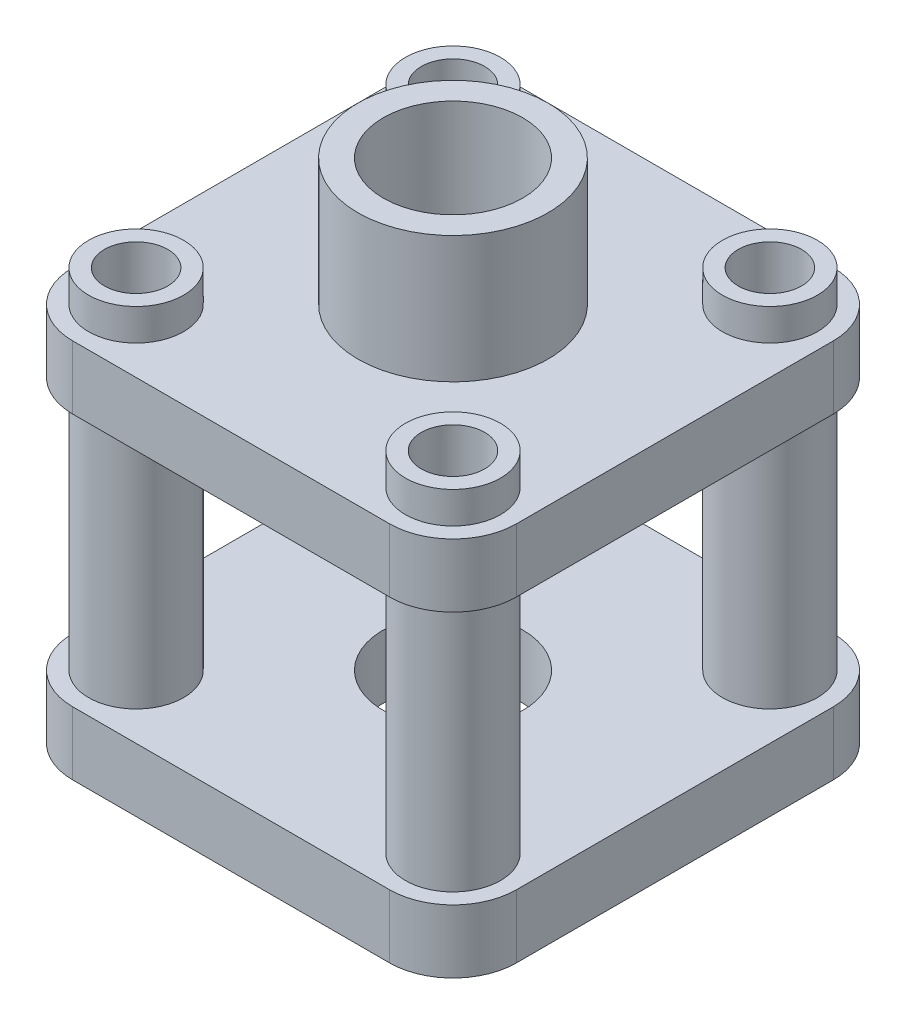
ISO-10303-21;
HEADER;
FILE_DESCRIPTION(('STEP AP214'),'2;1');
FILE_NAME('part.step','',(''),(''),'','','');
FILE_SCHEMA(('AUTOMOTIVE_DESIGN { 1 0 10303 214 1 1 1 1 }'));
ENDSEC;
DATA;
#1=APPLICATION_CONTEXT('core data for automotive mechanical design processes');
#2=APPLICATION_PROTOCOL_DEFINITION('international standard','automotive_design',2000,#1);
#3=PRODUCT_CONTEXT('',#1,'mechanical');
#4=PRODUCT('Part','Part','',(#3));
#5=PRODUCT_RELATED_PRODUCT_CATEGORY('part','',(#4));
#6=PRODUCT_DEFINITION_FORMATION('','',#4);
#7=PRODUCT_DEFINITION_CONTEXT('part definition',#1,'design');
#8=PRODUCT_DEFINITION('design','',#6,#7);
#9=PRODUCT_DEFINITION_SHAPE('','',#8);
#10=(LENGTH_UNIT() NAMED_UNIT(*) SI_UNIT(.MILLI.,.METRE.));
#11=(NAMED_UNIT(*) PLANE_ANGLE_UNIT() SI_UNIT($,.RADIAN.));
#12=(NAMED_UNIT(*) SI_UNIT($,.STERADIAN.) SOLID_ANGLE_UNIT());
#13=UNCERTAINTY_MEASURE_WITH_UNIT(LENGTH_MEASURE(1.E-05),#10,'distance_accuracy_value','');
#14=(GEOMETRIC_REPRESENTATION_CONTEXT(3) GLOBAL_UNCERTAINTY_ASSIGNED_CONTEXT((#13)) GLOBAL_UNIT_ASSIGNED_CONTEXT((#10,
#11,#12)) REPRESENTATION_CONTEXT('',''));
#15=CARTESIAN_POINT('',(0.,0.,0.));
#16=DIRECTION('',(0.,0.,1.));
#17=DIRECTION('',(1.,0.,0.));
#18=AXIS2_PLACEMENT_3D('',#15,#16,#17);
#19=CARTESIAN_POINT('',(35.,-40.,35.));
#20=DIRECTION('',(-1.,0.,0.));
#21=DIRECTION('',(0.,0.,1.));
#22=AXIS2_PLACEMENT_3D('',#19,#20,#21);
#23=PLANE('',#22);
#24=DIRECTION('',(0.,0.,-1.));
#25=VECTOR('',#24,1.);
#26=CARTESIAN_POINT('',(35.,-40.,35.));
#27=LINE('',#26,#25);
#28=CARTESIAN_POINT('',(35.,-40.,25.));
#29=VERTEX_POINT('',#28);
#30=CARTESIAN_POINT('',(35.,-40.,-25.));
#31=VERTEX_POINT('',#30);
#32=EDGE_CURVE('E220',#29,#31,#27,.T.);
#33=ORIENTED_EDGE('',*,*,#32,.F.);
#34=DIRECTION('',(0.,-1.,0.));
#35=VECTOR('',#34,1.);
#36=CARTESIAN_POINT('',(35.,-40.,25.));
#37=LINE('',#36,#35);
#38=CARTESIAN_POINT('',(35.,-50.,25.));
#39=VERTEX_POINT('',#38);
#40=EDGE_CURVE('E317',#29,#39,#37,.T.);
#41=ORIENTED_EDGE('',*,*,#40,.T.);
#42=DIRECTION('',(0.,0.,-1.));
#43=VECTOR('',#42,1.);
#44=CARTESIAN_POINT('',(35.,-50.,35.));
#45=LINE('',#44,#43);
#46=CARTESIAN_POINT('',(35.,-50.,-25.));
#47=VERTEX_POINT('',#46);
#48=EDGE_CURVE('E234',#39,#47,#45,.T.);
#49=ORIENTED_EDGE('',*,*,#48,.T.);
#50=DIRECTION('',(0.,-1.,0.));
#51=VECTOR('',#50,1.);
#52=CARTESIAN_POINT('',(35.,-40.,-25.));
#53=LINE('',#52,#51);
#54=EDGE_CURVE('E314',#47,#31,#53,.F.);
#55=ORIENTED_EDGE('',*,*,#54,.T.);
#56=EDGE_LOOP('',(#33,#41,#49,#55));
#57=FACE_BOUND('',#56,.T.);
#58=ADVANCED_FACE('F41',(#57),#23,.F.);
#59=CARTESIAN_POINT('',(-35.,-40.,-35.));
#60=DIRECTION('',(0.,0.,1.));
#61=DIRECTION('',(1.,0.,0.));
#62=AXIS2_PLACEMENT_3D('',#59,#60,#61);
#63=PLANE('',#62);
#64=DIRECTION('',(-1.,0.,0.));
#65=VECTOR('',#64,1.);
#66=CARTESIAN_POINT('',(-35.,-40.,-35.));
#67=LINE('',#66,#65);
#68=CARTESIAN_POINT('',(25.,-40.,-35.));
#69=VERTEX_POINT('',#68);
#70=CARTESIAN_POINT('',(-25.,-40.,-35.));
#71=VERTEX_POINT('',#70);
#72=EDGE_CURVE('E224',#69,#71,#67,.T.);
#73=ORIENTED_EDGE('',*,*,#72,.F.);
#74=DIRECTION('',(0.,-1.,0.));
#75=VECTOR('',#74,1.);
#76=CARTESIAN_POINT('',(25.,-40.,-35.));
#77=LINE('',#76,#75);
#78=CARTESIAN_POINT('',(25.,-50.,-35.));
#79=VERTEX_POINT('',#78);
#80=EDGE_CURVE('E354',#69,#79,#77,.T.);
#81=ORIENTED_EDGE('',*,*,#80,.T.);
#82=DIRECTION('',(-1.,0.,0.));
#83=VECTOR('',#82,1.);
#84=CARTESIAN_POINT('',(-35.,-50.,-35.));
#85=LINE('',#84,#83);
#86=CARTESIAN_POINT('',(-25.,-50.,-35.));
#87=VERTEX_POINT('',#86);
#88=EDGE_CURVE('E238',#79,#87,#85,.T.);
#89=ORIENTED_EDGE('',*,*,#88,.T.);
#90=DIRECTION('',(0.,-1.,0.));
#91=VECTOR('',#90,1.);
#92=CARTESIAN_POINT('',(-25.,-40.,-35.));
#93=LINE('',#92,#91);
#94=EDGE_CURVE('E351',#87,#71,#93,.F.);
#95=ORIENTED_EDGE('',*,*,#94,.T.);
#96=EDGE_LOOP('',(#73,#81,#89,#95));
#97=FACE_BOUND('',#96,.T.);
#98=ADVANCED_FACE('F414',(#97),#63,.F.);
#99=CARTESIAN_POINT('',(-35.,-40.,35.));
#100=DIRECTION('',(1.,0.,0.));
#101=DIRECTION('',(0.,0.,-1.));
#102=AXIS2_PLACEMENT_3D('',#99,#100,#101);
#103=PLANE('',#102);
#104=DIRECTION('',(0.,0.,1.));
#105=VECTOR('',#104,1.);
#106=CARTESIAN_POINT('',(-35.,-40.,35.));
#107=LINE('',#106,#105);
#108=CARTESIAN_POINT('',(-35.,-40.,-25.));
#109=VERTEX_POINT('',#108);
#110=CARTESIAN_POINT('',(-35.,-40.,25.));
#111=VERTEX_POINT('',#110);
#112=EDGE_CURVE('E228',#109,#111,#107,.T.);
#113=ORIENTED_EDGE('',*,*,#112,.F.);
#114=DIRECTION('',(0.,-1.,0.));
#115=VECTOR('',#114,1.);
#116=CARTESIAN_POINT('',(-35.,-40.,-25.));
#117=LINE('',#116,#115);
#118=CARTESIAN_POINT('',(-35.,-50.,-25.));
#119=VERTEX_POINT('',#118);
#120=EDGE_CURVE('E11',#109,#119,#117,.T.);
#121=ORIENTED_EDGE('',*,*,#120,.T.);
#122=DIRECTION('',(0.,0.,1.));
#123=VECTOR('',#122,1.);
#124=CARTESIAN_POINT('',(-35.,-50.,35.));
#125=LINE('',#124,#123);
#126=CARTESIAN_POINT('',(-35.,-50.,25.));
#127=VERTEX_POINT('',#126);
#128=EDGE_CURVE('E242',#119,#127,#125,.T.);
#129=ORIENTED_EDGE('',*,*,#128,.T.);
#130=DIRECTION('',(0.,-1.,0.));
#131=VECTOR('',#130,1.);
#132=CARTESIAN_POINT('',(-35.,-40.,25.));
#133=LINE('',#132,#131);
#134=EDGE_CURVE('E50',#127,#111,#133,.F.);
#135=ORIENTED_EDGE('',*,*,#134,.T.);
#136=EDGE_LOOP('',(#113,#121,#129,#135));
#137=FACE_BOUND('',#136,.T.);
#138=ADVANCED_FACE('F420',(#137),#103,.F.);
#139=CARTESIAN_POINT('',(-35.,-40.,35.));
#140=DIRECTION('',(0.,0.,-1.));
#141=DIRECTION('',(-1.,0.,0.));
#142=AXIS2_PLACEMENT_3D('',#139,#140,#141);
#143=PLANE('',#142);
#144=DIRECTION('',(1.,0.,0.));
#145=VECTOR('',#144,1.);
#146=CARTESIAN_POINT('',(-35.,-50.,35.));
#147=LINE('',#146,#145);
#148=CARTESIAN_POINT('',(-25.,-50.,35.));
#149=VERTEX_POINT('',#148);
#150=CARTESIAN_POINT('',(25.,-50.,35.));
#151=VERTEX_POINT('',#150);
#152=EDGE_CURVE('E225',#149,#151,#147,.T.);
#153=ORIENTED_EDGE('',*,*,#152,.T.);
#154=DIRECTION('',(0.,-1.,0.));
#155=VECTOR('',#154,1.);
#156=CARTESIAN_POINT('',(25.,-40.,35.));
#157=LINE('',#156,#155);
#158=CARTESIAN_POINT('',(25.,-40.,35.));
#159=VERTEX_POINT('',#158);
#160=EDGE_CURVE('E337',#151,#159,#157,.F.);
#161=ORIENTED_EDGE('',*,*,#160,.T.);
#162=DIRECTION('',(1.,0.,0.));
#163=VECTOR('',#162,1.);
#164=CARTESIAN_POINT('',(-35.,-40.,35.));
#165=LINE('',#164,#163);
#166=CARTESIAN_POINT('',(-25.,-40.,35.));
#167=VERTEX_POINT('',#166);
#168=EDGE_CURVE('E207',#167,#159,#165,.T.);
#169=ORIENTED_EDGE('',*,*,#168,.F.);
#170=DIRECTION('',(0.,-1.,0.));
#171=VECTOR('',#170,1.);
#172=CARTESIAN_POINT('',(-25.,-40.,35.));
#173=LINE('',#172,#171);
#174=EDGE_CURVE('E333',#167,#149,#173,.T.);
#175=ORIENTED_EDGE('',*,*,#174,.T.);
#176=EDGE_LOOP('',(#153,#161,#169,#175));
#177=FACE_BOUND('',#176,.T.);
#178=ADVANCED_FACE('F465',(#177),#143,.F.);
#179=CARTESIAN_POINT('',(0.,-40.,0.));
#180=DIRECTION('',(0.,-1.,0.));
#181=DIRECTION('',(0.,0.,-1.));
#182=AXIS2_PLACEMENT_3D('',#179,#180,#181);
#183=PLANE('',#182);
#184=CARTESIAN_POINT('',(0.,-40.,0.));
#185=DIRECTION('',(0.,-1.,0.));
#186=DIRECTION('',(0.,0.,-1.));
#187=AXIS2_PLACEMENT_3D('',#184,#185,#186);
#188=CIRCLE('',#187,11.);
#189=CARTESIAN_POINT('',(0.,-40.,-11.));
#190=VERTEX_POINT('',#189);
#191=EDGE_CURVE('E885',#190,#190,#188,.T.);
#192=ORIENTED_EDGE('',*,*,#191,.T.);
#193=EDGE_LOOP('',(#192));
#194=FACE_BOUND('',#193,.T.);
#195=CARTESIAN_POINT('',(25.,-40.,25.));
#196=DIRECTION('',(0.,-1.,0.));
#197=DIRECTION('',(0.,0.,-1.));
#198=AXIS2_PLACEMENT_3D('',#195,#196,#197);
#199=CIRCLE('',#198,7.5);
#200=CARTESIAN_POINT('',(25.,-40.,17.5));
#201=VERTEX_POINT('',#200);
#202=EDGE_CURVE('E832',#201,#201,#199,.T.);
#203=ORIENTED_EDGE('',*,*,#202,.T.);
#204=EDGE_LOOP('',(#203));
#205=FACE_BOUND('',#204,.T.);
#206=CARTESIAN_POINT('',(-25.,-40.,25.));
#207=DIRECTION('',(0.,-1.,0.));
#208=DIRECTION('',(0.,0.,-1.));
#209=AXIS2_PLACEMENT_3D('',#206,#207,#208);
#210=CIRCLE('',#209,7.5);
#211=CARTESIAN_POINT('',(-25.,-40.,17.5));
#212=VERTEX_POINT('',#211);
#213=EDGE_CURVE('E267',#212,#212,#210,.F.);
#214=ORIENTED_EDGE('',*,*,#213,.F.);
#215=EDGE_LOOP('',(#214));
#216=FACE_BOUND('',#215,.T.);
#217=CARTESIAN_POINT('',(25.,-40.,-25.));
#218=DIRECTION('',(0.,-1.,0.));
#219=DIRECTION('',(0.,0.,-1.));
#220=AXIS2_PLACEMENT_3D('',#217,#218,#219);
#221=CIRCLE('',#220,7.5);
#222=CARTESIAN_POINT('',(25.,-40.,-32.5));
#223=VERTEX_POINT('',#222);
#224=EDGE_CURVE('E365',#223,#223,#221,.F.);
#225=ORIENTED_EDGE('',*,*,#224,.F.);
#226=EDGE_LOOP('',(#225));
#227=FACE_BOUND('',#226,.T.);
#228=CARTESIAN_POINT('',(-25.,-40.,-25.));
#229=DIRECTION('',(0.,-1.,0.));
#230=DIRECTION('',(0.,0.,-1.));
#231=AXIS2_PLACEMENT_3D('',#228,#229,#230);
#232=CIRCLE('',#231,7.5);
#233=CARTESIAN_POINT('',(-25.,-40.,-32.5));
#234=VERTEX_POINT('',#233);
#235=EDGE_CURVE('E219',#234,#234,#232,.T.);
#236=ORIENTED_EDGE('',*,*,#235,.T.);
#237=EDGE_LOOP('',(#236));
#238=FACE_BOUND('',#237,.T.);
#239=ORIENTED_EDGE('',*,*,#168,.T.);
#240=CARTESIAN_POINT('',(25.,-40.,25.));
#241=DIRECTION('',(0.,-1.,0.));
#242=DIRECTION('',(0.,0.,-1.));
#243=AXIS2_PLACEMENT_3D('',#240,#241,#242);
#244=CIRCLE('',#243,10.);
#245=EDGE_CURVE('E348',#159,#29,#244,.F.);
#246=ORIENTED_EDGE('',*,*,#245,.T.);
#247=ORIENTED_EDGE('',*,*,#32,.T.);
#248=CARTESIAN_POINT('',(25.,-40.,-25.));
#249=DIRECTION('',(0.,-1.,0.));
#250=DIRECTION('',(0.,0.,-1.));
#251=AXIS2_PLACEMENT_3D('',#248,#249,#250);
#252=CIRCLE('',#251,10.);
#253=EDGE_CURVE('E345',#31,#69,#252,.F.);
#254=ORIENTED_EDGE('',*,*,#253,.T.);
#255=ORIENTED_EDGE('',*,*,#72,.T.);
#256=CARTESIAN_POINT('',(-25.,-40.,-25.));
#257=DIRECTION('',(0.,-1.,0.));
#258=DIRECTION('',(0.,0.,-1.));
#259=AXIS2_PLACEMENT_3D('',#256,#257,#258);
#260=CIRCLE('',#259,10.);
#261=EDGE_CURVE('E63',#71,#109,#260,.F.);
#262=ORIENTED_EDGE('',*,*,#261,.T.);
#263=ORIENTED_EDGE('',*,*,#112,.T.);
#264=CARTESIAN_POINT('',(-25.,-40.,25.));
#265=DIRECTION('',(0.,-1.,0.));
#266=DIRECTION('',(0.,0.,-1.));
#267=AXIS2_PLACEMENT_3D('',#264,#265,#266);
#268=CIRCLE('',#267,10.);
#269=EDGE_CURVE('E340',#111,#167,#268,.F.);
#270=ORIENTED_EDGE('',*,*,#269,.T.);
#271=EDGE_LOOP('',(#239,#246,#247,#254,#255,#262,#263,#270));
#272=FACE_BOUND('',#271,.T.);
#273=ADVANCED_FACE('F468',(#194,#205,#216,#227,#238,#272),#183,.F.);
#274=CARTESIAN_POINT('',(0.,-50.,0.));
#275=DIRECTION('',(0.,-1.,0.));
#276=DIRECTION('',(0.,0.,-1.));
#277=AXIS2_PLACEMENT_3D('',#274,#275,#276);
#278=PLANE('',#277);
#279=CARTESIAN_POINT('',(-25.,-50.,-25.));
#280=DIRECTION('',(0.,-1.,0.));
#281=DIRECTION('',(0.,0.,-1.));
#282=AXIS2_PLACEMENT_3D('',#279,#280,#281);
#283=CIRCLE('',#282,5.);
#284=CARTESIAN_POINT('',(-25.,-50.,-30.));
#285=VERTEX_POINT('',#284);
#286=EDGE_CURVE('E902',#285,#285,#283,.T.);
#287=ORIENTED_EDGE('',*,*,#286,.F.);
#288=EDGE_LOOP('',(#287));
#289=FACE_BOUND('',#288,.T.);
#290=CARTESIAN_POINT('',(25.,-50.,25.));
#291=DIRECTION('',(0.,-1.,0.));
#292=DIRECTION('',(0.,0.,-1.));
#293=AXIS2_PLACEMENT_3D('',#290,#291,#292);
#294=CIRCLE('',#293,5.);
#295=CARTESIAN_POINT('',(25.,-50.,20.));
#296=VERTEX_POINT('',#295);
#297=EDGE_CURVE('E273',#296,#296,#294,.T.);
#298=ORIENTED_EDGE('',*,*,#297,.F.);
#299=EDGE_LOOP('',(#298));
#300=FACE_BOUND('',#299,.T.);
#301=CARTESIAN_POINT('',(25.,-50.,-25.));
#302=DIRECTION('',(0.,-1.,0.));
#303=DIRECTION('',(0.,0.,-1.));
#304=AXIS2_PLACEMENT_3D('',#301,#302,#303);
#305=CIRCLE('',#304,5.);
#306=CARTESIAN_POINT('',(25.,-50.,-30.));
#307=VERTEX_POINT('',#306);
#308=EDGE_CURVE('E898',#307,#307,#305,.T.);
#309=ORIENTED_EDGE('',*,*,#308,.F.);
#310=EDGE_LOOP('',(#309));
#311=FACE_BOUND('',#310,.T.);
#312=CARTESIAN_POINT('',(0.,-50.,0.));
#313=DIRECTION('',(0.,-1.,0.));
#314=DIRECTION('',(0.,0.,-1.));
#315=AXIS2_PLACEMENT_3D('',#312,#313,#314);
#316=CIRCLE('',#315,11.);
#317=CARTESIAN_POINT('',(0.,-50.,-11.));
#318=VERTEX_POINT('',#317);
#319=EDGE_CURVE('E272',#318,#318,#316,.T.);
#320=ORIENTED_EDGE('',*,*,#319,.F.);
#321=EDGE_LOOP('',(#320));
#322=FACE_BOUND('',#321,.T.);
#323=CARTESIAN_POINT('',(-25.,-50.,25.));
#324=DIRECTION('',(0.,-1.,0.));
#325=DIRECTION('',(0.,0.,-1.));
#326=AXIS2_PLACEMENT_3D('',#323,#324,#325);
#327=CIRCLE('',#326,5.);
#328=CARTESIAN_POINT('',(-25.,-50.,20.));
#329=VERTEX_POINT('',#328);
#330=EDGE_CURVE('E894',#329,#329,#327,.T.);
#331=ORIENTED_EDGE('',*,*,#330,.F.);
#332=EDGE_LOOP('',(#331));
#333=FACE_BOUND('',#332,.T.);
#334=ORIENTED_EDGE('',*,*,#48,.F.);
#335=CARTESIAN_POINT('',(25.,-50.,25.));
#336=DIRECTION('',(0.,-1.,0.));
#337=DIRECTION('',(0.,0.,-1.));
#338=AXIS2_PLACEMENT_3D('',#335,#336,#337);
#339=CIRCLE('',#338,10.);
#340=EDGE_CURVE('E330',#39,#151,#339,.T.);
#341=ORIENTED_EDGE('',*,*,#340,.T.);
#342=ORIENTED_EDGE('',*,*,#152,.F.);
#343=CARTESIAN_POINT('',(-25.,-50.,25.));
#344=DIRECTION('',(0.,-1.,0.));
#345=DIRECTION('',(0.,0.,-1.));
#346=AXIS2_PLACEMENT_3D('',#343,#344,#345);
#347=CIRCLE('',#346,10.);
#348=EDGE_CURVE('E321',#149,#127,#347,.T.);
#349=ORIENTED_EDGE('',*,*,#348,.T.);
#350=ORIENTED_EDGE('',*,*,#128,.F.);
#351=CARTESIAN_POINT('',(-25.,-50.,-25.));
#352=DIRECTION('',(0.,-1.,0.));
#353=DIRECTION('',(0.,0.,-1.));
#354=AXIS2_PLACEMENT_3D('',#351,#352,#353);
#355=CIRCLE('',#354,10.);
#356=EDGE_CURVE('E324',#119,#87,#355,.T.);
#357=ORIENTED_EDGE('',*,*,#356,.T.);
#358=ORIENTED_EDGE('',*,*,#88,.F.);
#359=CARTESIAN_POINT('',(25.,-50.,-25.));
#360=DIRECTION('',(0.,-1.,0.));
#361=DIRECTION('',(0.,0.,-1.));
#362=AXIS2_PLACEMENT_3D('',#359,#360,#361);
#363=CIRCLE('',#362,10.);
#364=EDGE_CURVE('E327',#79,#47,#363,.T.);
#365=ORIENTED_EDGE('',*,*,#364,.T.);
#366=EDGE_LOOP('',(#334,#341,#342,#349,#350,#357,#358,#365));
#367=FACE_BOUND('',#366,.T.);
#368=ADVANCED_FACE('F458',(#289,#300,#311,#322,#333,#367),#278,.T.);
#369=CARTESIAN_POINT('',(-25.,15.,-25.));
#370=DIRECTION('',(0.,-1.,0.));
#371=DIRECTION('',(0.,0.,-1.));
#372=AXIS2_PLACEMENT_3D('',#369,#370,#371);
#373=CYLINDRICAL_SURFACE('',#372,7.5);
#374=CARTESIAN_POINT('',(-25.,0.,-25.));
#375=DIRECTION('',(0.,-1.,0.));
#376=DIRECTION('',(0.,0.,-1.));
#377=AXIS2_PLACEMENT_3D('',#374,#375,#376);
#378=CIRCLE('',#377,7.5);
#379=CARTESIAN_POINT('',(-25.,0.,-32.5));
#380=VERTEX_POINT('',#379);
#381=EDGE_CURVE('E202',#380,#380,#378,.F.);
#382=ORIENTED_EDGE('',*,*,#381,.F.);
#383=EDGE_LOOP('',(#382));
#384=FACE_BOUND('',#383,.T.);
#385=ORIENTED_EDGE('',*,*,#235,.F.);
#386=EDGE_LOOP('',(#385));
#387=FACE_BOUND('',#386,.T.);
#388=ADVANCED_FACE('F481',(#384,#387),#373,.T.);
#389=CARTESIAN_POINT('',(35.,10.,35.));
#390=DIRECTION('',(-1.,0.,0.));
#391=DIRECTION('',(0.,0.,1.));
#392=AXIS2_PLACEMENT_3D('',#389,#390,#391);
#393=PLANE('',#392);
#394=DIRECTION('',(0.,0.,-1.));
#395=VECTOR('',#394,1.);
#396=CARTESIAN_POINT('',(35.,0.,35.));
#397=LINE('',#396,#395);
#398=CARTESIAN_POINT('',(35.,0.,25.));
#399=VERTEX_POINT('',#398);
#400=CARTESIAN_POINT('',(35.,0.,-25.));
#401=VERTEX_POINT('',#400);
#402=EDGE_CURVE('E386',#399,#401,#397,.T.);
#403=ORIENTED_EDGE('',*,*,#402,.T.);
#404=DIRECTION('',(0.,-1.,0.));
#405=VECTOR('',#404,1.);
#406=CARTESIAN_POINT('',(35.,10.,-25.));
#407=LINE('',#406,#405);
#408=CARTESIAN_POINT('',(35.,10.,-25.));
#409=VERTEX_POINT('',#408);
#410=EDGE_CURVE('E311',#401,#409,#407,.F.);
#411=ORIENTED_EDGE('',*,*,#410,.T.);
#412=DIRECTION('',(0.,0.,-1.));
#413=VECTOR('',#412,1.);
#414=CARTESIAN_POINT('',(35.,10.,35.));
#415=LINE('',#414,#413);
#416=CARTESIAN_POINT('',(35.,10.,25.));
#417=VERTEX_POINT('',#416);
#418=EDGE_CURVE('E185',#417,#409,#415,.T.);
#419=ORIENTED_EDGE('',*,*,#418,.F.);
#420=DIRECTION('',(0.,-1.,0.));
#421=VECTOR('',#420,1.);
#422=CARTESIAN_POINT('',(35.,10.,25.));
#423=LINE('',#422,#421);
#424=EDGE_CURVE('E307',#417,#399,#423,.T.);
#425=ORIENTED_EDGE('',*,*,#424,.T.);
#426=EDGE_LOOP('',(#403,#411,#419,#425));
#427=FACE_BOUND('',#426,.T.);
#428=ADVANCED_FACE('F411',(#427),#393,.F.);
#429=CARTESIAN_POINT('',(-35.,10.,-35.));
#430=DIRECTION('',(0.,0.,1.));
#431=DIRECTION('',(1.,0.,0.));
#432=AXIS2_PLACEMENT_3D('',#429,#430,#431);
#433=PLANE('',#432);
#434=DIRECTION('',(-1.,0.,0.));
#435=VECTOR('',#434,1.);
#436=CARTESIAN_POINT('',(-35.,0.,-35.));
#437=LINE('',#436,#435);
#438=CARTESIAN_POINT('',(25.,0.,-35.));
#439=VERTEX_POINT('',#438);
#440=CARTESIAN_POINT('',(-25.,0.,-35.));
#441=VERTEX_POINT('',#440);
#442=EDGE_CURVE('E193',#439,#441,#437,.T.);
#443=ORIENTED_EDGE('',*,*,#442,.T.);
#444=DIRECTION('',(0.,-1.,0.));
#445=VECTOR('',#444,1.);
#446=CARTESIAN_POINT('',(-25.,10.,-35.));
#447=LINE('',#446,#445);
#448=CARTESIAN_POINT('',(-25.,10.,-35.));
#449=VERTEX_POINT('',#448);
#450=EDGE_CURVE('E304',#441,#449,#447,.F.);
#451=ORIENTED_EDGE('',*,*,#450,.T.);
#452=DIRECTION('',(-1.,0.,0.));
#453=VECTOR('',#452,1.);
#454=CARTESIAN_POINT('',(-35.,10.,-35.));
#455=LINE('',#454,#453);
#456=CARTESIAN_POINT('',(25.,10.,-35.));
#457=VERTEX_POINT('',#456);
#458=EDGE_CURVE('E191',#457,#449,#455,.T.);
#459=ORIENTED_EDGE('',*,*,#458,.F.);
#460=DIRECTION('',(0.,-1.,0.));
#461=VECTOR('',#460,1.);
#462=CARTESIAN_POINT('',(25.,10.,-35.));
#463=LINE('',#462,#461);
#464=EDGE_CURVE('E300',#457,#439,#463,.T.);
#465=ORIENTED_EDGE('',*,*,#464,.T.);
#466=EDGE_LOOP('',(#443,#451,#459,#465));
#467=FACE_BOUND('',#466,.T.);
#468=ADVANCED_FACE('F395',(#467),#433,.F.);
#469=CARTESIAN_POINT('',(-35.,10.,35.));
#470=DIRECTION('',(1.,0.,0.));
#471=DIRECTION('',(0.,0.,-1.));
#472=AXIS2_PLACEMENT_3D('',#469,#470,#471);
#473=PLANE('',#472);
#474=DIRECTION('',(0.,0.,1.));
#475=VECTOR('',#474,1.);
#476=CARTESIAN_POINT('',(-35.,0.,35.));
#477=LINE('',#476,#475);
#478=CARTESIAN_POINT('',(-35.,0.,-25.));
#479=VERTEX_POINT('',#478);
#480=CARTESIAN_POINT('',(-35.,0.,25.));
#481=VERTEX_POINT('',#480);
#482=EDGE_CURVE('E186',#479,#481,#477,.T.);
#483=ORIENTED_EDGE('',*,*,#482,.T.);
#484=DIRECTION('',(0.,-1.,0.));
#485=VECTOR('',#484,1.);
#486=CARTESIAN_POINT('',(-35.,10.,25.));
#487=LINE('',#486,#485);
#488=CARTESIAN_POINT('',(-35.,10.,25.));
#489=VERTEX_POINT('',#488);
#490=EDGE_CURVE('E161',#481,#489,#487,.F.);
#491=ORIENTED_EDGE('',*,*,#490,.T.);
#492=DIRECTION('',(0.,0.,1.));
#493=VECTOR('',#492,1.);
#494=CARTESIAN_POINT('',(-35.,10.,35.));
#495=LINE('',#494,#493);
#496=CARTESIAN_POINT('',(-35.,10.,-25.));
#497=VERTEX_POINT('',#496);
#498=EDGE_CURVE('E374',#497,#489,#495,.T.);
#499=ORIENTED_EDGE('',*,*,#498,.F.);
#500=DIRECTION('',(0.,-1.,0.));
#501=VECTOR('',#500,1.);
#502=CARTESIAN_POINT('',(-35.,10.,-25.));
#503=LINE('',#502,#501);
#504=EDGE_CURVE('E167',#497,#479,#503,.T.);
#505=ORIENTED_EDGE('',*,*,#504,.T.);
#506=EDGE_LOOP('',(#483,#491,#499,#505));
#507=FACE_BOUND('',#506,.T.);
#508=ADVANCED_FACE('F403',(#507),#473,.F.);
#509=CARTESIAN_POINT('',(-35.,10.,35.));
#510=DIRECTION('',(0.,0.,-1.));
#511=DIRECTION('',(-1.,0.,0.));
#512=AXIS2_PLACEMENT_3D('',#509,#510,#511);
#513=PLANE('',#512);
#514=DIRECTION('',(1.,0.,0.));
#515=VECTOR('',#514,1.);
#516=CARTESIAN_POINT('',(-35.,10.,35.));
#517=LINE('',#516,#515);
#518=CARTESIAN_POINT('',(-25.,10.,35.));
#519=VERTEX_POINT('',#518);
#520=CARTESIAN_POINT('',(25.,10.,35.));
#521=VERTEX_POINT('',#520);
#522=EDGE_CURVE('E177',#519,#521,#517,.T.);
#523=ORIENTED_EDGE('',*,*,#522,.F.);
#524=DIRECTION('',(0.,-1.,0.));
#525=VECTOR('',#524,1.);
#526=CARTESIAN_POINT('',(-25.,10.,35.));
#527=LINE('',#526,#525);
#528=CARTESIAN_POINT('',(-25.,0.,35.));
#529=VERTEX_POINT('',#528);
#530=EDGE_CURVE('E160',#519,#529,#527,.T.);
#531=ORIENTED_EDGE('',*,*,#530,.T.);
#532=DIRECTION('',(1.,0.,0.));
#533=VECTOR('',#532,1.);
#534=CARTESIAN_POINT('',(-35.,0.,35.));
#535=LINE('',#534,#533);
#536=CARTESIAN_POINT('',(25.,0.,35.));
#537=VERTEX_POINT('',#536);
#538=EDGE_CURVE('E174',#529,#537,#535,.T.);
#539=ORIENTED_EDGE('',*,*,#538,.T.);
#540=DIRECTION('',(0.,-1.,0.));
#541=VECTOR('',#540,1.);
#542=CARTESIAN_POINT('',(25.,10.,35.));
#543=LINE('',#542,#541);
#544=EDGE_CURVE('E180',#537,#521,#543,.F.);
#545=ORIENTED_EDGE('',*,*,#544,.T.);
#546=EDGE_LOOP('',(#523,#531,#539,#545));
#547=FACE_BOUND('',#546,.T.);
#548=ADVANCED_FACE('F173',(#547),#513,.F.);
#549=CARTESIAN_POINT('',(0.,10.,0.));
#550=DIRECTION('',(0.,-1.,0.));
#551=DIRECTION('',(0.,0.,-1.));
#552=AXIS2_PLACEMENT_3D('',#549,#550,#551);
#553=PLANE('',#552);
#554=CARTESIAN_POINT('',(25.,10.,25.));
#555=DIRECTION('',(0.,-1.,0.));
#556=DIRECTION('',(0.,0.,-1.));
#557=AXIS2_PLACEMENT_3D('',#554,#555,#556);
#558=CIRCLE('',#557,7.5);
#559=CARTESIAN_POINT('',(25.,10.,17.5));
#560=VERTEX_POINT('',#559);
#561=EDGE_CURVE('E835',#560,#560,#558,.T.);
#562=ORIENTED_EDGE('',*,*,#561,.T.);
#563=EDGE_LOOP('',(#562));
#564=FACE_BOUND('',#563,.T.);
#565=CARTESIAN_POINT('',(-25.,10.,25.));
#566=DIRECTION('',(0.,-1.,0.));
#567=DIRECTION('',(0.,0.,-1.));
#568=AXIS2_PLACEMENT_3D('',#565,#566,#567);
#569=CIRCLE('',#568,7.5);
#570=CARTESIAN_POINT('',(-25.,10.,17.5));
#571=VERTEX_POINT('',#570);
#572=EDGE_CURVE('E361',#571,#571,#569,.F.);
#573=ORIENTED_EDGE('',*,*,#572,.F.);
#574=EDGE_LOOP('',(#573));
#575=FACE_BOUND('',#574,.T.);
#576=CARTESIAN_POINT('',(25.,10.,-25.));
#577=DIRECTION('',(0.,-1.,0.));
#578=DIRECTION('',(0.,0.,-1.));
#579=AXIS2_PLACEMENT_3D('',#576,#577,#578);
#580=CIRCLE('',#579,7.5);
#581=CARTESIAN_POINT('',(25.,10.,-32.5));
#582=VERTEX_POINT('',#581);
#583=EDGE_CURVE('E206',#582,#582,#580,.F.);
#584=ORIENTED_EDGE('',*,*,#583,.F.);
#585=EDGE_LOOP('',(#584));
#586=FACE_BOUND('',#585,.T.);
#587=CARTESIAN_POINT('',(-25.,10.,-25.));
#588=DIRECTION('',(0.,-1.,0.));
#589=DIRECTION('',(0.,0.,-1.));
#590=AXIS2_PLACEMENT_3D('',#587,#588,#589);
#591=CIRCLE('',#590,7.5);
#592=CARTESIAN_POINT('',(-25.,10.,-32.5));
#593=VERTEX_POINT('',#592);
#594=EDGE_CURVE('E201',#593,#593,#591,.F.);
#595=ORIENTED_EDGE('',*,*,#594,.F.);
#596=EDGE_LOOP('',(#595));
#597=FACE_BOUND('',#596,.T.);
#598=CARTESIAN_POINT('',(0.,10.,0.));
#599=DIRECTION('',(0.,-1.,0.));
#600=DIRECTION('',(0.,0.,-1.));
#601=AXIS2_PLACEMENT_3D('',#598,#599,#600);
#602=CIRCLE('',#601,15.);
#603=CARTESIAN_POINT('',(0.,10.,-15.));
#604=VERTEX_POINT('',#603);
#605=EDGE_CURVE('E197',#604,#604,#602,.F.);
#606=ORIENTED_EDGE('',*,*,#605,.F.);
#607=EDGE_LOOP('',(#606));
#608=FACE_BOUND('',#607,.T.);
#609=ORIENTED_EDGE('',*,*,#498,.T.);
#610=CARTESIAN_POINT('',(-25.,10.,25.));
#611=DIRECTION('',(0.,-1.,0.));
#612=DIRECTION('',(0.,0.,-1.));
#613=AXIS2_PLACEMENT_3D('',#610,#611,#612);
#614=CIRCLE('',#613,10.);
#615=EDGE_CURVE('E297',#489,#519,#614,.F.);
#616=ORIENTED_EDGE('',*,*,#615,.T.);
#617=ORIENTED_EDGE('',*,*,#522,.T.);
#618=CARTESIAN_POINT('',(25.,10.,25.));
#619=DIRECTION('',(0.,-1.,0.));
#620=DIRECTION('',(0.,0.,-1.));
#621=AXIS2_PLACEMENT_3D('',#618,#619,#620);
#622=CIRCLE('',#621,10.);
#623=EDGE_CURVE('E288',#521,#417,#622,.F.);
#624=ORIENTED_EDGE('',*,*,#623,.T.);
#625=ORIENTED_EDGE('',*,*,#418,.T.);
#626=CARTESIAN_POINT('',(25.,10.,-25.));
#627=DIRECTION('',(0.,-1.,0.));
#628=DIRECTION('',(0.,0.,-1.));
#629=AXIS2_PLACEMENT_3D('',#626,#627,#628);
#630=CIRCLE('',#629,10.);
#631=EDGE_CURVE('E291',#409,#457,#630,.F.);
#632=ORIENTED_EDGE('',*,*,#631,.T.);
#633=ORIENTED_EDGE('',*,*,#458,.T.);
#634=CARTESIAN_POINT('',(-25.,10.,-25.));
#635=DIRECTION('',(0.,-1.,0.));
#636=DIRECTION('',(0.,0.,-1.));
#637=AXIS2_PLACEMENT_3D('',#634,#635,#636);
#638=CIRCLE('',#637,10.);
#639=EDGE_CURVE('E294',#449,#497,#638,.F.);
#640=ORIENTED_EDGE('',*,*,#639,.T.);
#641=EDGE_LOOP('',(#609,#616,#617,#624,#625,#632,#633,#640));
#642=FACE_BOUND('',#641,.T.);
#643=ADVANCED_FACE('F401',(#564,#575,#586,#597,#608,#642),#553,.F.);
#644=CARTESIAN_POINT('',(0.,0.,0.));
#645=DIRECTION('',(0.,-1.,0.));
#646=DIRECTION('',(0.,0.,-1.));
#647=AXIS2_PLACEMENT_3D('',#644,#645,#646);
#648=PLANE('',#647);
#649=CARTESIAN_POINT('',(0.,0.,0.));
#650=DIRECTION('',(0.,-1.,0.));
#651=DIRECTION('',(0.,0.,-1.));
#652=AXIS2_PLACEMENT_3D('',#649,#650,#651);
#653=CIRCLE('',#652,11.);
#654=CARTESIAN_POINT('',(0.,0.,-11.));
#655=VERTEX_POINT('',#654);
#656=EDGE_CURVE('E268',#655,#655,#653,.T.);
#657=ORIENTED_EDGE('',*,*,#656,.F.);
#658=EDGE_LOOP('',(#657));
#659=FACE_BOUND('',#658,.T.);
#660=CARTESIAN_POINT('',(25.,0.,25.));
#661=DIRECTION('',(0.,-1.,0.));
#662=DIRECTION('',(0.,0.,-1.));
#663=AXIS2_PLACEMENT_3D('',#660,#661,#662);
#664=CIRCLE('',#663,7.5);
#665=CARTESIAN_POINT('',(25.,0.,17.5));
#666=VERTEX_POINT('',#665);
#667=EDGE_CURVE('E263',#666,#666,#664,.T.);
#668=ORIENTED_EDGE('',*,*,#667,.F.);
#669=EDGE_LOOP('',(#668));
#670=FACE_BOUND('',#669,.T.);
#671=CARTESIAN_POINT('',(-25.,0.,25.));
#672=DIRECTION('',(0.,-1.,0.));
#673=DIRECTION('',(0.,0.,-1.));
#674=AXIS2_PLACEMENT_3D('',#671,#672,#673);
#675=CIRCLE('',#674,7.5);
#676=CARTESIAN_POINT('',(-25.,0.,17.5));
#677=VERTEX_POINT('',#676);
#678=EDGE_CURVE('E257',#677,#677,#675,.F.);
#679=ORIENTED_EDGE('',*,*,#678,.T.);
#680=EDGE_LOOP('',(#679));
#681=FACE_BOUND('',#680,.T.);
#682=CARTESIAN_POINT('',(25.,0.,-25.));
#683=DIRECTION('',(0.,-1.,0.));
#684=DIRECTION('',(0.,0.,-1.));
#685=AXIS2_PLACEMENT_3D('',#682,#683,#684);
#686=CIRCLE('',#685,7.5);
#687=CARTESIAN_POINT('',(25.,0.,-32.5));
#688=VERTEX_POINT('',#687);
#689=EDGE_CURVE('E251',#688,#688,#686,.F.);
#690=ORIENTED_EDGE('',*,*,#689,.T.);
#691=EDGE_LOOP('',(#690));
#692=FACE_BOUND('',#691,.T.);
#693=ORIENTED_EDGE('',*,*,#381,.T.);
#694=EDGE_LOOP('',(#693));
#695=FACE_BOUND('',#694,.T.);
#696=ORIENTED_EDGE('',*,*,#538,.F.);
#697=CARTESIAN_POINT('',(-25.,0.,25.));
#698=DIRECTION('',(0.,-1.,0.));
#699=DIRECTION('',(0.,0.,-1.));
#700=AXIS2_PLACEMENT_3D('',#697,#698,#699);
#701=CIRCLE('',#700,10.);
#702=EDGE_CURVE('E156',#529,#481,#701,.T.);
#703=ORIENTED_EDGE('',*,*,#702,.T.);
#704=ORIENTED_EDGE('',*,*,#482,.F.);
#705=CARTESIAN_POINT('',(-25.,0.,-25.));
#706=DIRECTION('',(0.,-1.,0.));
#707=DIRECTION('',(0.,0.,-1.));
#708=AXIS2_PLACEMENT_3D('',#705,#706,#707);
#709=CIRCLE('',#708,10.);
#710=EDGE_CURVE('E168',#479,#441,#709,.T.);
#711=ORIENTED_EDGE('',*,*,#710,.T.);
#712=ORIENTED_EDGE('',*,*,#442,.F.);
#713=CARTESIAN_POINT('',(25.,0.,-25.));
#714=DIRECTION('',(0.,-1.,0.));
#715=DIRECTION('',(0.,0.,-1.));
#716=AXIS2_PLACEMENT_3D('',#713,#714,#715);
#717=CIRCLE('',#716,10.);
#718=EDGE_CURVE('E278',#439,#401,#717,.T.);
#719=ORIENTED_EDGE('',*,*,#718,.T.);
#720=ORIENTED_EDGE('',*,*,#402,.F.);
#721=CARTESIAN_POINT('',(25.,0.,25.));
#722=DIRECTION('',(0.,-1.,0.));
#723=DIRECTION('',(0.,0.,-1.));
#724=AXIS2_PLACEMENT_3D('',#721,#722,#723);
#725=CIRCLE('',#724,10.);
#726=EDGE_CURVE('E179',#399,#537,#725,.T.);
#727=ORIENTED_EDGE('',*,*,#726,.T.);
#728=EDGE_LOOP('',(#696,#703,#704,#711,#712,#719,#720,#727));
#729=FACE_BOUND('',#728,.T.);
#730=ADVANCED_FACE('F182',(#659,#670,#681,#692,#695,#729),#648,.T.);
#731=CARTESIAN_POINT('',(0.,30.,0.));
#732=DIRECTION('',(0.,-1.,0.));
#733=DIRECTION('',(0.,0.,-1.));
#734=AXIS2_PLACEMENT_3D('',#731,#732,#733);
#735=CYLINDRICAL_SURFACE('',#734,11.);
#736=CARTESIAN_POINT('',(0.,30.,0.));
#737=DIRECTION('',(0.,1.,0.));
#738=DIRECTION('',(0.,0.,1.));
#739=AXIS2_PLACEMENT_3D('',#736,#737,#738);
#740=CIRCLE('',#739,11.);
#741=CARTESIAN_POINT('',(0.,30.,11.));
#742=VERTEX_POINT('',#741);
#743=EDGE_CURVE('E255',#742,#742,#740,.T.);
#744=ORIENTED_EDGE('',*,*,#743,.T.);
#745=EDGE_LOOP('',(#744));
#746=FACE_BOUND('',#745,.T.);
#747=ORIENTED_EDGE('',*,*,#656,.T.);
#748=EDGE_LOOP('',(#747));
#749=FACE_BOUND('',#748,.T.);
#750=ADVANCED_FACE('F552',(#746,#749),#735,.F.);
#751=CARTESIAN_POINT('',(0.,30.,0.));
#752=DIRECTION('',(0.,-1.,0.));
#753=DIRECTION('',(0.,0.,-1.));
#754=AXIS2_PLACEMENT_3D('',#751,#752,#753);
#755=CYLINDRICAL_SURFACE('',#754,15.);
#756=CARTESIAN_POINT('',(0.,30.,0.));
#757=DIRECTION('',(0.,1.,0.));
#758=DIRECTION('',(0.,0.,1.));
#759=AXIS2_PLACEMENT_3D('',#756,#757,#758);
#760=CIRCLE('',#759,15.);
#761=CARTESIAN_POINT('',(0.,30.,15.));
#762=VERTEX_POINT('',#761);
#763=EDGE_CURVE('E389',#762,#762,#760,.T.);
#764=ORIENTED_EDGE('',*,*,#763,.F.);
#765=EDGE_LOOP('',(#764));
#766=FACE_BOUND('',#765,.T.);
#767=ORIENTED_EDGE('',*,*,#605,.T.);
#768=EDGE_LOOP('',(#767));
#769=FACE_BOUND('',#768,.T.);
#770=ADVANCED_FACE('F733',(#766,#769),#755,.T.);
#771=CARTESIAN_POINT('',(0.,30.,0.));
#772=DIRECTION('',(0.,1.,0.));
#773=DIRECTION('',(0.,0.,1.));
#774=AXIS2_PLACEMENT_3D('',#771,#772,#773);
#775=PLANE('',#774);
#776=ORIENTED_EDGE('',*,*,#743,.F.);
#777=EDGE_LOOP('',(#776));
#778=FACE_BOUND('',#777,.T.);
#779=ORIENTED_EDGE('',*,*,#763,.T.);
#780=EDGE_LOOP('',(#779));
#781=FACE_BOUND('',#780,.T.);
#782=ADVANCED_FACE('F726',(#778,#781),#775,.T.);
#783=CARTESIAN_POINT('',(-25.,15.,-25.));
#784=DIRECTION('',(0.,1.,0.));
#785=DIRECTION('',(0.,0.,1.));
#786=AXIS2_PLACEMENT_3D('',#783,#784,#785);
#787=CIRCLE('',#786,7.5);
#788=CARTESIAN_POINT('',(-25.,15.,-17.5));
#789=VERTEX_POINT('',#788);
#790=EDGE_CURVE('E211',#789,#789,#787,.F.);
#791=ORIENTED_EDGE('',*,*,#790,.T.);
#792=EDGE_LOOP('',(#791));
#793=FACE_BOUND('',#792,.T.);
#794=ORIENTED_EDGE('',*,*,#594,.T.);
#795=EDGE_LOOP('',(#794));
#796=FACE_BOUND('',#795,.T.);
#797=ADVANCED_FACE('F718',(#793,#796),#373,.T.);
#798=CARTESIAN_POINT('',(0.,15.,0.));
#799=DIRECTION('',(0.,1.,0.));
#800=DIRECTION('',(0.,0.,1.));
#801=AXIS2_PLACEMENT_3D('',#798,#799,#800);
#802=PLANE('',#801);
#803=ORIENTED_EDGE('',*,*,#790,.F.);
#804=EDGE_LOOP('',(#803));
#805=FACE_BOUND('',#804,.T.);
#806=CARTESIAN_POINT('',(-25.,15.,-25.));
#807=DIRECTION('',(0.,1.,0.));
#808=DIRECTION('',(0.,0.,1.));
#809=AXIS2_PLACEMENT_3D('',#806,#807,#808);
#810=CIRCLE('',#809,5.);
#811=CARTESIAN_POINT('',(-25.,15.,-20.));
#812=VERTEX_POINT('',#811);
#813=EDGE_CURVE('E215',#812,#812,#810,.F.);
#814=ORIENTED_EDGE('',*,*,#813,.T.);
#815=EDGE_LOOP('',(#814));
#816=FACE_BOUND('',#815,.T.);
#817=ADVANCED_FACE('F711',(#805,#816),#802,.T.);
#818=CARTESIAN_POINT('',(25.,15.,-25.));
#819=DIRECTION('',(0.,-1.,0.));
#820=DIRECTION('',(0.,0.,-1.));
#821=AXIS2_PLACEMENT_3D('',#818,#819,#820);
#822=CYLINDRICAL_SURFACE('',#821,7.5);
#823=ORIENTED_EDGE('',*,*,#689,.F.);
#824=EDGE_LOOP('',(#823));
#825=FACE_BOUND('',#824,.T.);
#826=ORIENTED_EDGE('',*,*,#224,.T.);
#827=EDGE_LOOP('',(#826));
#828=FACE_BOUND('',#827,.T.);
#829=ADVANCED_FACE('F703',(#825,#828),#822,.T.);
#830=CARTESIAN_POINT('',(25.,15.,-25.));
#831=DIRECTION('',(0.,1.,0.));
#832=DIRECTION('',(0.,0.,1.));
#833=AXIS2_PLACEMENT_3D('',#830,#831,#832);
#834=CIRCLE('',#833,7.5);
#835=CARTESIAN_POINT('',(25.,15.,-17.5));
#836=VERTEX_POINT('',#835);
#837=EDGE_CURVE('E256',#836,#836,#834,.T.);
#838=ORIENTED_EDGE('',*,*,#837,.F.);
#839=EDGE_LOOP('',(#838));
#840=FACE_BOUND('',#839,.T.);
#841=ORIENTED_EDGE('',*,*,#583,.T.);
#842=EDGE_LOOP('',(#841));
#843=FACE_BOUND('',#842,.T.);
#844=ADVANCED_FACE('F695',(#840,#843),#822,.T.);
#845=CARTESIAN_POINT('',(0.,15.,0.));
#846=DIRECTION('',(0.,1.,0.));
#847=DIRECTION('',(0.,0.,1.));
#848=AXIS2_PLACEMENT_3D('',#845,#846,#847);
#849=PLANE('',#848);
#850=CARTESIAN_POINT('',(25.,15.,-25.));
#851=DIRECTION('',(0.,1.,0.));
#852=DIRECTION('',(0.,0.,1.));
#853=AXIS2_PLACEMENT_3D('',#850,#851,#852);
#854=CIRCLE('',#853,5.);
#855=CARTESIAN_POINT('',(25.,15.,-20.));
#856=VERTEX_POINT('',#855);
#857=EDGE_CURVE('E261',#856,#856,#854,.T.);
#858=ORIENTED_EDGE('',*,*,#857,.F.);
#859=EDGE_LOOP('',(#858));
#860=FACE_BOUND('',#859,.T.);
#861=ORIENTED_EDGE('',*,*,#837,.T.);
#862=EDGE_LOOP('',(#861));
#863=FACE_BOUND('',#862,.T.);
#864=ADVANCED_FACE('F688',(#860,#863),#849,.T.);
#865=CARTESIAN_POINT('',(-25.,15.,25.));
#866=DIRECTION('',(0.,-1.,0.));
#867=DIRECTION('',(0.,0.,-1.));
#868=AXIS2_PLACEMENT_3D('',#865,#866,#867);
#869=CYLINDRICAL_SURFACE('',#868,7.5);
#870=ORIENTED_EDGE('',*,*,#678,.F.);
#871=EDGE_LOOP('',(#870));
#872=FACE_BOUND('',#871,.T.);
#873=ORIENTED_EDGE('',*,*,#213,.T.);
#874=EDGE_LOOP('',(#873));
#875=FACE_BOUND('',#874,.T.);
#876=ADVANCED_FACE('F680',(#872,#875),#869,.T.);
#877=CARTESIAN_POINT('',(-25.,15.,25.));
#878=DIRECTION('',(0.,1.,0.));
#879=DIRECTION('',(0.,0.,1.));
#880=AXIS2_PLACEMENT_3D('',#877,#878,#879);
#881=CIRCLE('',#880,7.5);
#882=CARTESIAN_POINT('',(-25.,15.,32.5));
#883=VERTEX_POINT('',#882);
#884=EDGE_CURVE('E262',#883,#883,#881,.T.);
#885=ORIENTED_EDGE('',*,*,#884,.F.);
#886=EDGE_LOOP('',(#885));
#887=FACE_BOUND('',#886,.T.);
#888=ORIENTED_EDGE('',*,*,#572,.T.);
#889=EDGE_LOOP('',(#888));
#890=FACE_BOUND('',#889,.T.);
#891=ADVANCED_FACE('F672',(#887,#890),#869,.T.);
#892=CARTESIAN_POINT('',(0.,15.,0.));
#893=DIRECTION('',(0.,1.,0.));
#894=DIRECTION('',(0.,0.,1.));
#895=AXIS2_PLACEMENT_3D('',#892,#893,#894);
#896=PLANE('',#895);
#897=CARTESIAN_POINT('',(-25.,15.,25.));
#898=DIRECTION('',(0.,1.,0.));
#899=DIRECTION('',(0.,0.,1.));
#900=AXIS2_PLACEMENT_3D('',#897,#898,#899);
#901=CIRCLE('',#900,5.);
#902=CARTESIAN_POINT('',(-25.,15.,30.));
#903=VERTEX_POINT('',#902);
#904=EDGE_CURVE('E834',#903,#903,#901,.T.);
#905=ORIENTED_EDGE('',*,*,#904,.F.);
#906=EDGE_LOOP('',(#905));
#907=FACE_BOUND('',#906,.T.);
#908=ORIENTED_EDGE('',*,*,#884,.T.);
#909=EDGE_LOOP('',(#908));
#910=FACE_BOUND('',#909,.T.);
#911=ADVANCED_FACE('F665',(#907,#910),#896,.T.);
#912=CARTESIAN_POINT('',(25.,15.,25.));
#913=DIRECTION('',(0.,-1.,0.));
#914=DIRECTION('',(0.,0.,-1.));
#915=AXIS2_PLACEMENT_3D('',#912,#913,#914);
#916=CYLINDRICAL_SURFACE('',#915,7.5);
#917=ORIENTED_EDGE('',*,*,#667,.T.);
#918=EDGE_LOOP('',(#917));
#919=FACE_BOUND('',#918,.T.);
#920=ORIENTED_EDGE('',*,*,#202,.F.);
#921=EDGE_LOOP('',(#920));
#922=FACE_BOUND('',#921,.T.);
#923=ADVANCED_FACE('F657',(#919,#922),#916,.T.);
#924=CARTESIAN_POINT('',(25.,15.,25.));
#925=DIRECTION('',(0.,1.,0.));
#926=DIRECTION('',(0.,0.,1.));
#927=AXIS2_PLACEMENT_3D('',#924,#925,#926);
#928=CIRCLE('',#927,7.5);
#929=CARTESIAN_POINT('',(25.,15.,32.5));
#930=VERTEX_POINT('',#929);
#931=EDGE_CURVE('E881',#930,#930,#928,.F.);
#932=ORIENTED_EDGE('',*,*,#931,.T.);
#933=EDGE_LOOP('',(#932));
#934=FACE_BOUND('',#933,.T.);
#935=ORIENTED_EDGE('',*,*,#561,.F.);
#936=EDGE_LOOP('',(#935));
#937=FACE_BOUND('',#936,.T.);
#938=ADVANCED_FACE('F649',(#934,#937),#916,.T.);
#939=CARTESIAN_POINT('',(0.,15.,0.));
#940=DIRECTION('',(0.,1.,0.));
#941=DIRECTION('',(0.,0.,1.));
#942=AXIS2_PLACEMENT_3D('',#939,#940,#941);
#943=PLANE('',#942);
#944=ORIENTED_EDGE('',*,*,#931,.F.);
#945=EDGE_LOOP('',(#944));
#946=FACE_BOUND('',#945,.T.);
#947=CARTESIAN_POINT('',(25.,15.,25.));
#948=DIRECTION('',(0.,1.,0.));
#949=DIRECTION('',(0.,0.,1.));
#950=AXIS2_PLACEMENT_3D('',#947,#948,#949);
#951=CIRCLE('',#950,5.);
#952=CARTESIAN_POINT('',(25.,15.,30.));
#953=VERTEX_POINT('',#952);
#954=EDGE_CURVE('E842',#953,#953,#951,.F.);
#955=ORIENTED_EDGE('',*,*,#954,.T.);
#956=EDGE_LOOP('',(#955));
#957=FACE_BOUND('',#956,.T.);
#958=ADVANCED_FACE('F640',(#946,#957),#943,.T.);
#959=CARTESIAN_POINT('',(0.,-90.,0.));
#960=DIRECTION('',(0.,1.,0.));
#961=DIRECTION('',(0.,0.,1.));
#962=AXIS2_PLACEMENT_3D('',#959,#960,#961);
#963=CYLINDRICAL_SURFACE('',#962,11.);
#964=ORIENTED_EDGE('',*,*,#319,.T.);
#965=EDGE_LOOP('',(#964));
#966=FACE_BOUND('',#965,.T.);
#967=ORIENTED_EDGE('',*,*,#191,.F.);
#968=EDGE_LOOP('',(#967));
#969=FACE_BOUND('',#968,.T.);
#970=ADVANCED_FACE('F633',(#966,#969),#963,.F.);
#971=CARTESIAN_POINT('',(-25.,15.,-25.));
#972=DIRECTION('',(0.,-1.,0.));
#973=DIRECTION('',(0.,0.,-1.));
#974=AXIS2_PLACEMENT_3D('',#971,#972,#973);
#975=CYLINDRICAL_SURFACE('',#974,5.);
#976=ORIENTED_EDGE('',*,*,#286,.T.);
#977=EDGE_LOOP('',(#976));
#978=FACE_BOUND('',#977,.T.);
#979=ORIENTED_EDGE('',*,*,#813,.F.);
#980=EDGE_LOOP('',(#979));
#981=FACE_BOUND('',#980,.T.);
#982=ADVANCED_FACE('F625',(#978,#981),#975,.F.);
#983=CARTESIAN_POINT('',(25.,15.,-25.));
#984=DIRECTION('',(0.,-1.,0.));
#985=DIRECTION('',(0.,0.,-1.));
#986=AXIS2_PLACEMENT_3D('',#983,#984,#985);
#987=CYLINDRICAL_SURFACE('',#986,5.);
#988=ORIENTED_EDGE('',*,*,#308,.T.);
#989=EDGE_LOOP('',(#988));
#990=FACE_BOUND('',#989,.T.);
#991=ORIENTED_EDGE('',*,*,#857,.T.);
#992=EDGE_LOOP('',(#991));
#993=FACE_BOUND('',#992,.T.);
#994=ADVANCED_FACE('F617',(#990,#993),#987,.F.);
#995=CARTESIAN_POINT('',(-25.,15.,25.));
#996=DIRECTION('',(0.,-1.,0.));
#997=DIRECTION('',(0.,0.,-1.));
#998=AXIS2_PLACEMENT_3D('',#995,#996,#997);
#999=CYLINDRICAL_SURFACE('',#998,5.);
#1000=ORIENTED_EDGE('',*,*,#330,.T.);
#1001=EDGE_LOOP('',(#1000));
#1002=FACE_BOUND('',#1001,.T.);
#1003=ORIENTED_EDGE('',*,*,#904,.T.);
#1004=EDGE_LOOP('',(#1003));
#1005=FACE_BOUND('',#1004,.T.);
#1006=ADVANCED_FACE('F610',(#1002,#1005),#999,.F.);
#1007=CARTESIAN_POINT('',(25.,15.,25.));
#1008=DIRECTION('',(0.,-1.,0.));
#1009=DIRECTION('',(0.,0.,-1.));
#1010=AXIS2_PLACEMENT_3D('',#1007,#1008,#1009);
#1011=CYLINDRICAL_SURFACE('',#1010,5.);
#1012=ORIENTED_EDGE('',*,*,#297,.T.);
#1013=EDGE_LOOP('',(#1012));
#1014=FACE_BOUND('',#1013,.T.);
#1015=ORIENTED_EDGE('',*,*,#954,.F.);
#1016=EDGE_LOOP('',(#1015));
#1017=FACE_BOUND('',#1016,.T.);
#1018=ADVANCED_FACE('F428',(#1014,#1017),#1011,.F.);
#1019=CARTESIAN_POINT('',(-25.,10.,25.));
#1020=DIRECTION('',(0.,-1.,0.));
#1021=DIRECTION('',(0.,0.,-1.));
#1022=AXIS2_PLACEMENT_3D('',#1019,#1020,#1021);
#1023=CYLINDRICAL_SURFACE('',#1022,10.);
#1024=ORIENTED_EDGE('',*,*,#615,.F.);
#1025=ORIENTED_EDGE('',*,*,#490,.F.);
#1026=ORIENTED_EDGE('',*,*,#702,.F.);
#1027=ORIENTED_EDGE('',*,*,#530,.F.);
#1028=EDGE_LOOP('',(#1024,#1025,#1026,#1027));
#1029=FACE_BOUND('',#1028,.T.);
#1030=ADVANCED_FACE('F159',(#1029),#1023,.T.);
#1031=CARTESIAN_POINT('',(-25.,10.,-25.));
#1032=DIRECTION('',(0.,-1.,0.));
#1033=DIRECTION('',(0.,0.,-1.));
#1034=AXIS2_PLACEMENT_3D('',#1031,#1032,#1033);
#1035=CYLINDRICAL_SURFACE('',#1034,10.);
#1036=ORIENTED_EDGE('',*,*,#639,.F.);
#1037=ORIENTED_EDGE('',*,*,#450,.F.);
#1038=ORIENTED_EDGE('',*,*,#710,.F.);
#1039=ORIENTED_EDGE('',*,*,#504,.F.);
#1040=EDGE_LOOP('',(#1036,#1037,#1038,#1039));
#1041=FACE_BOUND('',#1040,.T.);
#1042=ADVANCED_FACE('F398',(#1041),#1035,.T.);
#1043=CARTESIAN_POINT('',(25.,10.,-25.));
#1044=DIRECTION('',(0.,-1.,0.));
#1045=DIRECTION('',(0.,0.,-1.));
#1046=AXIS2_PLACEMENT_3D('',#1043,#1044,#1045);
#1047=CYLINDRICAL_SURFACE('',#1046,10.);
#1048=ORIENTED_EDGE('',*,*,#631,.F.);
#1049=ORIENTED_EDGE('',*,*,#410,.F.);
#1050=ORIENTED_EDGE('',*,*,#718,.F.);
#1051=ORIENTED_EDGE('',*,*,#464,.F.);
#1052=EDGE_LOOP('',(#1048,#1049,#1050,#1051));
#1053=FACE_BOUND('',#1052,.T.);
#1054=ADVANCED_FACE('F431',(#1053),#1047,.T.);
#1055=CARTESIAN_POINT('',(25.,10.,25.));
#1056=DIRECTION('',(0.,-1.,0.));
#1057=DIRECTION('',(0.,0.,-1.));
#1058=AXIS2_PLACEMENT_3D('',#1055,#1056,#1057);
#1059=CYLINDRICAL_SURFACE('',#1058,10.);
#1060=ORIENTED_EDGE('',*,*,#623,.F.);
#1061=ORIENTED_EDGE('',*,*,#544,.F.);
#1062=ORIENTED_EDGE('',*,*,#726,.F.);
#1063=ORIENTED_EDGE('',*,*,#424,.F.);
#1064=EDGE_LOOP('',(#1060,#1061,#1062,#1063));
#1065=FACE_BOUND('',#1064,.T.);
#1066=ADVANCED_FACE('F434',(#1065),#1059,.T.);
#1067=CARTESIAN_POINT('',(25.,-40.,25.));
#1068=DIRECTION('',(0.,-1.,0.));
#1069=DIRECTION('',(0.,0.,-1.));
#1070=AXIS2_PLACEMENT_3D('',#1067,#1068,#1069);
#1071=CYLINDRICAL_SURFACE('',#1070,10.);
#1072=ORIENTED_EDGE('',*,*,#245,.F.);
#1073=ORIENTED_EDGE('',*,*,#160,.F.);
#1074=ORIENTED_EDGE('',*,*,#340,.F.);
#1075=ORIENTED_EDGE('',*,*,#40,.F.);
#1076=EDGE_LOOP('',(#1072,#1073,#1074,#1075));
#1077=FACE_BOUND('',#1076,.T.);
#1078=ADVANCED_FACE('F438',(#1077),#1071,.T.);
#1079=CARTESIAN_POINT('',(25.,-40.,-25.));
#1080=DIRECTION('',(0.,-1.,0.));
#1081=DIRECTION('',(0.,0.,-1.));
#1082=AXIS2_PLACEMENT_3D('',#1079,#1080,#1081);
#1083=CYLINDRICAL_SURFACE('',#1082,10.);
#1084=ORIENTED_EDGE('',*,*,#253,.F.);
#1085=ORIENTED_EDGE('',*,*,#54,.F.);
#1086=ORIENTED_EDGE('',*,*,#364,.F.);
#1087=ORIENTED_EDGE('',*,*,#80,.F.);
#1088=EDGE_LOOP('',(#1084,#1085,#1086,#1087));
#1089=FACE_BOUND('',#1088,.T.);
#1090=ADVANCED_FACE('F442',(#1089),#1083,.T.);
#1091=CARTESIAN_POINT('',(-25.,-40.,-25.));
#1092=DIRECTION('',(0.,-1.,0.));
#1093=DIRECTION('',(0.,0.,-1.));
#1094=AXIS2_PLACEMENT_3D('',#1091,#1092,#1093);
#1095=CYLINDRICAL_SURFACE('',#1094,10.);
#1096=ORIENTED_EDGE('',*,*,#261,.F.);
#1097=ORIENTED_EDGE('',*,*,#94,.F.);
#1098=ORIENTED_EDGE('',*,*,#356,.F.);
#1099=ORIENTED_EDGE('',*,*,#120,.F.);
#1100=EDGE_LOOP('',(#1096,#1097,#1098,#1099));
#1101=FACE_BOUND('',#1100,.T.);
#1102=ADVANCED_FACE('F445',(#1101),#1095,.T.);
#1103=CARTESIAN_POINT('',(-25.,-40.,25.));
#1104=DIRECTION('',(0.,-1.,0.));
#1105=DIRECTION('',(0.,0.,-1.));
#1106=AXIS2_PLACEMENT_3D('',#1103,#1104,#1105);
#1107=CYLINDRICAL_SURFACE('',#1106,10.);
#1108=ORIENTED_EDGE('',*,*,#269,.F.);
#1109=ORIENTED_EDGE('',*,*,#134,.F.);
#1110=ORIENTED_EDGE('',*,*,#348,.F.);
#1111=ORIENTED_EDGE('',*,*,#174,.F.);
#1112=EDGE_LOOP('',(#1108,#1109,#1110,#1111));
#1113=FACE_BOUND('',#1112,.T.);
#1114=ADVANCED_FACE('F43',(#1113),#1107,.T.);
#1115=CLOSED_SHELL('',(#58,#98,#138,#178,#273,#368,#388,#428,#468,#508,#548,#643,#730,#750,#770,
#782,#797,#817,#829,#844,#864,#876,#891,#911,#923,#938,#958,#970,#982,#994,#1006,#1018,#1030,
#1042,#1054,#1066,#1078,#1090,#1102,#1114));
#1116=MANIFOLD_SOLID_BREP('B2',#1115);
#1117=ADVANCED_BREP_SHAPE_REPRESENTATION('',(#18,#1116),#14);
#1118=SHAPE_DEFINITION_REPRESENTATION(#9,#1117);
ENDSEC;
END-ISO-10303-21;
